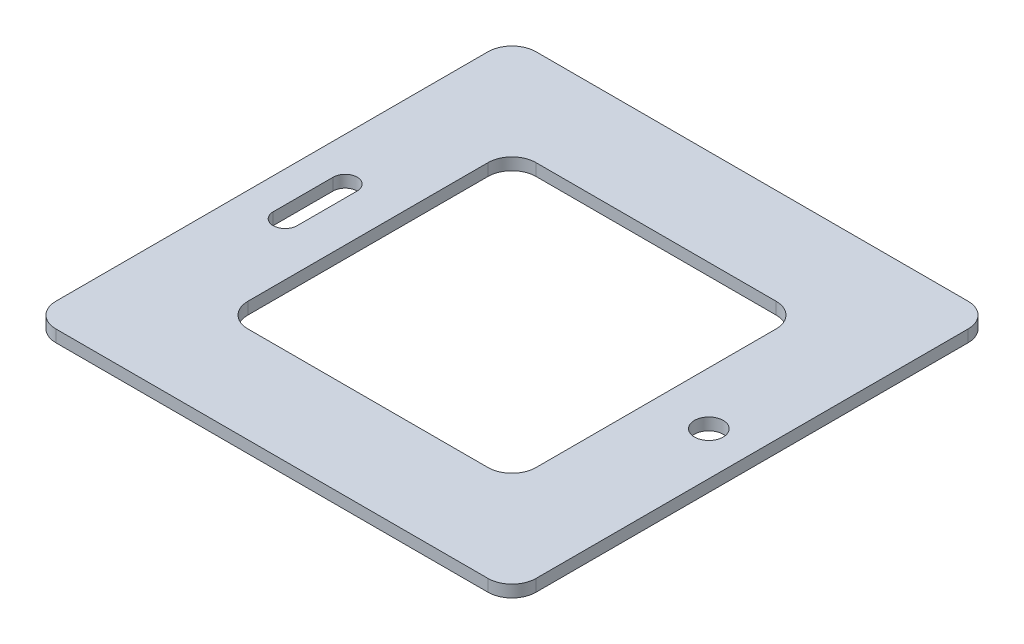
ISO-10303-21;
HEADER;
FILE_DESCRIPTION(('STEP AP214'),'2;1');
FILE_NAME('part.step','',(''),(''),'','','');
FILE_SCHEMA(('AUTOMOTIVE_DESIGN { 1 0 10303 214 1 1 1 1 }'));
ENDSEC;
DATA;
#1=APPLICATION_CONTEXT('core data for automotive mechanical design processes');
#2=APPLICATION_PROTOCOL_DEFINITION('international standard','automotive_design',2000,#1);
#3=PRODUCT_CONTEXT('',#1,'mechanical');
#4=PRODUCT('Part','Part','',(#3));
#5=PRODUCT_RELATED_PRODUCT_CATEGORY('part','',(#4));
#6=PRODUCT_DEFINITION_FORMATION('','',#4);
#7=PRODUCT_DEFINITION_CONTEXT('part definition',#1,'design');
#8=PRODUCT_DEFINITION('design','',#6,#7);
#9=PRODUCT_DEFINITION_SHAPE('','',#8);
#10=(LENGTH_UNIT() NAMED_UNIT(*) SI_UNIT(.MILLI.,.METRE.));
#11=(NAMED_UNIT(*) PLANE_ANGLE_UNIT() SI_UNIT($,.RADIAN.));
#12=(NAMED_UNIT(*) SI_UNIT($,.STERADIAN.) SOLID_ANGLE_UNIT());
#13=UNCERTAINTY_MEASURE_WITH_UNIT(LENGTH_MEASURE(1.E-05),#10,'distance_accuracy_value','');
#14=(GEOMETRIC_REPRESENTATION_CONTEXT(3) GLOBAL_UNCERTAINTY_ASSIGNED_CONTEXT((#13)) GLOBAL_UNIT_ASSIGNED_CONTEXT((#10,
#11,#12)) REPRESENTATION_CONTEXT('',''));
#15=CARTESIAN_POINT('',(0.,0.,0.));
#16=DIRECTION('',(0.,0.,1.));
#17=DIRECTION('',(1.,0.,0.));
#18=AXIS2_PLACEMENT_3D('',#15,#16,#17);
#19=CARTESIAN_POINT('',(0.,5.,0.));
#20=DIRECTION('',(0.,-1.,0.));
#21=DIRECTION('',(0.,0.,-1.));
#22=AXIS2_PLACEMENT_3D('',#19,#20,#21);
#23=PLANE('',#22);
#24=CARTESIAN_POINT('',(82.,5.,0.));
#25=DIRECTION('',(0.,1.,0.));
#26=DIRECTION('',(0.,0.,1.));
#27=AXIS2_PLACEMENT_3D('',#24,#25,#26);
#28=CIRCLE('',#27,6.);
#29=CARTESIAN_POINT('',(82.,5.,6.));
#30=VERTEX_POINT('',#29);
#31=EDGE_CURVE('E200',#30,#30,#28,.T.);
#32=ORIENTED_EDGE('',*,*,#31,.F.);
#33=EDGE_LOOP('',(#32));
#34=FACE_BOUND('',#33,.T.);
#35=DIRECTION('',(0.,0.,-1.));
#36=VECTOR('',#35,1.);
#37=CARTESIAN_POINT('',(-77.,5.,12.5));
#38=LINE('',#37,#36);
#39=CARTESIAN_POINT('',(-77.,5.,12.5));
#40=VERTEX_POINT('',#39);
#41=CARTESIAN_POINT('',(-77.,5.,-12.5));
#42=VERTEX_POINT('',#41);
#43=EDGE_CURVE('E199',#40,#42,#38,.T.);
#44=ORIENTED_EDGE('',*,*,#43,.F.);
#45=CARTESIAN_POINT('',(-82.,5.,12.5));
#46=DIRECTION('',(0.,1.,0.));
#47=DIRECTION('',(0.,0.,1.));
#48=AXIS2_PLACEMENT_3D('',#45,#46,#47);
#49=CIRCLE('',#48,5.);
#50=CARTESIAN_POINT('',(-87.,5.,12.5));
#51=VERTEX_POINT('',#50);
#52=EDGE_CURVE('E179',#51,#40,#49,.T.);
#53=ORIENTED_EDGE('',*,*,#52,.F.);
#54=DIRECTION('',(0.,0.,1.));
#55=VECTOR('',#54,1.);
#56=CARTESIAN_POINT('',(-87.,5.,12.5));
#57=LINE('',#56,#55);
#58=CARTESIAN_POINT('',(-87.,5.,-12.5));
#59=VERTEX_POINT('',#58);
#60=EDGE_CURVE('E188',#59,#51,#57,.T.);
#61=ORIENTED_EDGE('',*,*,#60,.F.);
#62=CARTESIAN_POINT('',(-82.,5.,-12.5));
#63=DIRECTION('',(0.,1.,0.));
#64=DIRECTION('',(0.,0.,1.));
#65=AXIS2_PLACEMENT_3D('',#62,#63,#64);
#66=CIRCLE('',#65,5.);
#67=EDGE_CURVE('E194',#42,#59,#66,.T.);
#68=ORIENTED_EDGE('',*,*,#67,.F.);
#69=EDGE_LOOP('',(#44,#53,#61,#68));
#70=FACE_BOUND('',#69,.T.);
#71=DIRECTION('',(-1.,0.,0.));
#72=VECTOR('',#71,1.);
#73=CARTESIAN_POINT('',(-100.,5.,-100.));
#74=LINE('',#73,#72);
#75=CARTESIAN_POINT('',(90.,5.,-100.));
#76=VERTEX_POINT('',#75);
#77=CARTESIAN_POINT('',(-90.,5.,-100.));
#78=VERTEX_POINT('',#77);
#79=EDGE_CURVE('E271',#76,#78,#74,.T.);
#80=ORIENTED_EDGE('',*,*,#79,.T.);
#81=CARTESIAN_POINT('',(-90.,5.,-90.));
#82=DIRECTION('',(0.,-1.,0.));
#83=DIRECTION('',(0.,0.,-1.));
#84=AXIS2_PLACEMENT_3D('',#81,#82,#83);
#85=CIRCLE('',#84,10.);
#86=CARTESIAN_POINT('',(-100.,5.,-90.));
#87=VERTEX_POINT('',#86);
#88=EDGE_CURVE('E321',#78,#87,#85,.F.);
#89=ORIENTED_EDGE('',*,*,#88,.T.);
#90=DIRECTION('',(0.,0.,1.));
#91=VECTOR('',#90,1.);
#92=CARTESIAN_POINT('',(-100.,5.,100.));
#93=LINE('',#92,#91);
#94=CARTESIAN_POINT('',(-100.,5.,90.));
#95=VERTEX_POINT('',#94);
#96=EDGE_CURVE('E275',#87,#95,#93,.T.);
#97=ORIENTED_EDGE('',*,*,#96,.T.);
#98=CARTESIAN_POINT('',(-90.,5.,90.));
#99=DIRECTION('',(0.,-1.,0.));
#100=DIRECTION('',(0.,0.,-1.));
#101=AXIS2_PLACEMENT_3D('',#98,#99,#100);
#102=CIRCLE('',#101,10.);
#103=CARTESIAN_POINT('',(-90.,5.,100.));
#104=VERTEX_POINT('',#103);
#105=EDGE_CURVE('E59',#95,#104,#102,.F.);
#106=ORIENTED_EDGE('',*,*,#105,.T.);
#107=DIRECTION('',(1.,0.,0.));
#108=VECTOR('',#107,1.);
#109=CARTESIAN_POINT('',(-100.,5.,100.));
#110=LINE('',#109,#108);
#111=CARTESIAN_POINT('',(90.,5.,100.));
#112=VERTEX_POINT('',#111);
#113=EDGE_CURVE('E277',#104,#112,#110,.T.);
#114=ORIENTED_EDGE('',*,*,#113,.T.);
#115=CARTESIAN_POINT('',(90.,5.,90.));
#116=DIRECTION('',(0.,-1.,0.));
#117=DIRECTION('',(0.,0.,-1.));
#118=AXIS2_PLACEMENT_3D('',#115,#116,#117);
#119=CIRCLE('',#118,10.);
#120=CARTESIAN_POINT('',(100.,5.,90.));
#121=VERTEX_POINT('',#120);
#122=EDGE_CURVE('E316',#112,#121,#119,.F.);
#123=ORIENTED_EDGE('',*,*,#122,.T.);
#124=DIRECTION('',(0.,0.,-1.));
#125=VECTOR('',#124,1.);
#126=CARTESIAN_POINT('',(100.,5.,100.));
#127=LINE('',#126,#125);
#128=CARTESIAN_POINT('',(100.,5.,-90.));
#129=VERTEX_POINT('',#128);
#130=EDGE_CURVE('E268',#121,#129,#127,.T.);
#131=ORIENTED_EDGE('',*,*,#130,.T.);
#132=CARTESIAN_POINT('',(90.,5.,-90.));
#133=DIRECTION('',(0.,-1.,0.));
#134=DIRECTION('',(0.,0.,-1.));
#135=AXIS2_PLACEMENT_3D('',#132,#133,#134);
#136=CIRCLE('',#135,10.);
#137=EDGE_CURVE('E318',#129,#76,#136,.F.);
#138=ORIENTED_EDGE('',*,*,#137,.T.);
#139=EDGE_LOOP('',(#80,#89,#97,#106,#114,#123,#131,#138));
#140=FACE_BOUND('',#139,.T.);
#141=CARTESIAN_POINT('',(-50.,5.,50.));
#142=DIRECTION('',(0.,1.,0.));
#143=DIRECTION('',(0.,0.,-1.));
#144=AXIS2_PLACEMENT_3D('',#141,#142,#143);
#145=CIRCLE('',#144,9.99999999999999);
#146=CARTESIAN_POINT('',(-60.,5.,49.9999999999999));
#147=VERTEX_POINT('',#146);
#148=CARTESIAN_POINT('',(-49.9999999999999,5.,60.));
#149=VERTEX_POINT('',#148);
#150=EDGE_CURVE('E208',#147,#149,#145,.T.);
#151=ORIENTED_EDGE('',*,*,#150,.F.);
#152=DIRECTION('',(0.,0.,1.));
#153=VECTOR('',#152,1.);
#154=CARTESIAN_POINT('',(-60.,5.,49.9999999999999));
#155=LINE('',#154,#153);
#156=CARTESIAN_POINT('',(-60.,5.,-49.9999999999999));
#157=VERTEX_POINT('',#156);
#158=EDGE_CURVE('E224',#157,#147,#155,.T.);
#159=ORIENTED_EDGE('',*,*,#158,.F.);
#160=CARTESIAN_POINT('',(-50.,5.,-50.));
#161=DIRECTION('',(0.,1.,0.));
#162=DIRECTION('',(0.,0.,-1.));
#163=AXIS2_PLACEMENT_3D('',#160,#161,#162);
#164=CIRCLE('',#163,9.99999999999999);
#165=CARTESIAN_POINT('',(-49.9999999999999,5.,-60.));
#166=VERTEX_POINT('',#165);
#167=EDGE_CURVE('E221',#166,#157,#164,.T.);
#168=ORIENTED_EDGE('',*,*,#167,.F.);
#169=DIRECTION('',(-1.,0.,0.));
#170=VECTOR('',#169,1.);
#171=CARTESIAN_POINT('',(-49.9999999999999,5.,-60.));
#172=LINE('',#171,#170);
#173=CARTESIAN_POINT('',(49.9999999999999,5.,-60.));
#174=VERTEX_POINT('',#173);
#175=EDGE_CURVE('E219',#174,#166,#172,.T.);
#176=ORIENTED_EDGE('',*,*,#175,.F.);
#177=CARTESIAN_POINT('',(50.,5.,-50.));
#178=DIRECTION('',(0.,1.,0.));
#179=DIRECTION('',(0.,0.,-1.));
#180=AXIS2_PLACEMENT_3D('',#177,#178,#179);
#181=CIRCLE('',#180,9.99999999999999);
#182=CARTESIAN_POINT('',(60.,5.,-49.9999999999999));
#183=VERTEX_POINT('',#182);
#184=EDGE_CURVE('E217',#183,#174,#181,.T.);
#185=ORIENTED_EDGE('',*,*,#184,.F.);
#186=DIRECTION('',(0.,0.,-1.));
#187=VECTOR('',#186,1.);
#188=CARTESIAN_POINT('',(60.,5.,49.9999999999999));
#189=LINE('',#188,#187);
#190=CARTESIAN_POINT('',(60.,5.,49.9999999999999));
#191=VERTEX_POINT('',#190);
#192=EDGE_CURVE('E215',#191,#183,#189,.T.);
#193=ORIENTED_EDGE('',*,*,#192,.F.);
#194=CARTESIAN_POINT('',(50.,5.,50.));
#195=DIRECTION('',(0.,1.,0.));
#196=DIRECTION('',(0.,0.,1.));
#197=AXIS2_PLACEMENT_3D('',#194,#195,#196);
#198=CIRCLE('',#197,9.99999999999999);
#199=CARTESIAN_POINT('',(49.9999999999999,5.,60.));
#200=VERTEX_POINT('',#199);
#201=EDGE_CURVE('E213',#200,#191,#198,.T.);
#202=ORIENTED_EDGE('',*,*,#201,.F.);
#203=DIRECTION('',(1.,0.,0.));
#204=VECTOR('',#203,1.);
#205=CARTESIAN_POINT('',(-49.9999999999999,5.,60.));
#206=LINE('',#205,#204);
#207=EDGE_CURVE('E210',#149,#200,#206,.T.);
#208=ORIENTED_EDGE('',*,*,#207,.F.);
#209=EDGE_LOOP('',(#151,#159,#168,#176,#185,#193,#202,#208));
#210=FACE_BOUND('',#209,.T.);
#211=ADVANCED_FACE('F37',(#34,#70,#140,#210),#23,.F.);
#212=CARTESIAN_POINT('',(0.,0.,0.));
#213=DIRECTION('',(0.,-1.,0.));
#214=DIRECTION('',(0.,0.,-1.));
#215=AXIS2_PLACEMENT_3D('',#212,#213,#214);
#216=PLANE('',#215);
#217=CARTESIAN_POINT('',(82.,0.,0.));
#218=DIRECTION('',(0.,-1.,0.));
#219=DIRECTION('',(0.,0.,-1.));
#220=AXIS2_PLACEMENT_3D('',#217,#218,#219);
#221=CIRCLE('',#220,6.);
#222=CARTESIAN_POINT('',(82.,0.,-6.));
#223=VERTEX_POINT('',#222);
#224=EDGE_CURVE('E203',#223,#223,#221,.T.);
#225=ORIENTED_EDGE('',*,*,#224,.F.);
#226=EDGE_LOOP('',(#225));
#227=FACE_BOUND('',#226,.T.);
#228=CARTESIAN_POINT('',(-82.,0.,12.5));
#229=DIRECTION('',(0.,-1.,0.));
#230=DIRECTION('',(0.,0.,-1.));
#231=AXIS2_PLACEMENT_3D('',#228,#229,#230);
#232=CIRCLE('',#231,5.);
#233=CARTESIAN_POINT('',(-77.,0.,12.5));
#234=VERTEX_POINT('',#233);
#235=CARTESIAN_POINT('',(-87.,0.,12.5));
#236=VERTEX_POINT('',#235);
#237=EDGE_CURVE('E182',#234,#236,#232,.T.);
#238=ORIENTED_EDGE('',*,*,#237,.F.);
#239=DIRECTION('',(0.,0.,1.));
#240=VECTOR('',#239,1.);
#241=CARTESIAN_POINT('',(-77.,0.,0.));
#242=LINE('',#241,#240);
#243=CARTESIAN_POINT('',(-77.,0.,-12.5));
#244=VERTEX_POINT('',#243);
#245=EDGE_CURVE('E279',#244,#234,#242,.T.);
#246=ORIENTED_EDGE('',*,*,#245,.F.);
#247=CARTESIAN_POINT('',(-82.,0.,-12.5));
#248=DIRECTION('',(0.,-1.,0.));
#249=DIRECTION('',(0.,0.,-1.));
#250=AXIS2_PLACEMENT_3D('',#247,#248,#249);
#251=CIRCLE('',#250,5.);
#252=CARTESIAN_POINT('',(-87.,0.,-12.5));
#253=VERTEX_POINT('',#252);
#254=EDGE_CURVE('E290',#253,#244,#251,.T.);
#255=ORIENTED_EDGE('',*,*,#254,.F.);
#256=DIRECTION('',(0.,0.,-1.));
#257=VECTOR('',#256,1.);
#258=CARTESIAN_POINT('',(-87.,0.,0.));
#259=LINE('',#258,#257);
#260=EDGE_CURVE('E293',#236,#253,#259,.T.);
#261=ORIENTED_EDGE('',*,*,#260,.F.);
#262=EDGE_LOOP('',(#238,#246,#255,#261));
#263=FACE_BOUND('',#262,.T.);
#264=DIRECTION('',(0.,0.,1.));
#265=VECTOR('',#264,1.);
#266=CARTESIAN_POINT('',(-100.,0.,100.));
#267=LINE('',#266,#265);
#268=CARTESIAN_POINT('',(-100.,0.,-90.));
#269=VERTEX_POINT('',#268);
#270=CARTESIAN_POINT('',(-100.,0.,90.));
#271=VERTEX_POINT('',#270);
#272=EDGE_CURVE('E285',#269,#271,#267,.T.);
#273=ORIENTED_EDGE('',*,*,#272,.F.);
#274=CARTESIAN_POINT('',(-90.,0.,-90.));
#275=DIRECTION('',(0.,-1.,0.));
#276=DIRECTION('',(0.,0.,-1.));
#277=AXIS2_PLACEMENT_3D('',#274,#275,#276);
#278=CIRCLE('',#277,10.);
#279=CARTESIAN_POINT('',(-90.,0.,-100.));
#280=VERTEX_POINT('',#279);
#281=EDGE_CURVE('E309',#269,#280,#278,.T.);
#282=ORIENTED_EDGE('',*,*,#281,.T.);
#283=DIRECTION('',(-1.,0.,0.));
#284=VECTOR('',#283,1.);
#285=CARTESIAN_POINT('',(-100.,0.,-100.));
#286=LINE('',#285,#284);
#287=CARTESIAN_POINT('',(90.,0.,-100.));
#288=VERTEX_POINT('',#287);
#289=EDGE_CURVE('E282',#288,#280,#286,.T.);
#290=ORIENTED_EDGE('',*,*,#289,.F.);
#291=CARTESIAN_POINT('',(90.,0.,-90.));
#292=DIRECTION('',(0.,-1.,0.));
#293=DIRECTION('',(0.,0.,-1.));
#294=AXIS2_PLACEMENT_3D('',#291,#292,#293);
#295=CIRCLE('',#294,10.);
#296=CARTESIAN_POINT('',(100.,0.,-90.));
#297=VERTEX_POINT('',#296);
#298=EDGE_CURVE('E305',#288,#297,#295,.T.);
#299=ORIENTED_EDGE('',*,*,#298,.T.);
#300=DIRECTION('',(0.,0.,-1.));
#301=VECTOR('',#300,1.);
#302=CARTESIAN_POINT('',(100.,0.,100.));
#303=LINE('',#302,#301);
#304=CARTESIAN_POINT('',(100.,0.,90.));
#305=VERTEX_POINT('',#304);
#306=EDGE_CURVE('E267',#305,#297,#303,.T.);
#307=ORIENTED_EDGE('',*,*,#306,.F.);
#308=CARTESIAN_POINT('',(90.,0.,90.));
#309=DIRECTION('',(0.,-1.,0.));
#310=DIRECTION('',(0.,0.,-1.));
#311=AXIS2_PLACEMENT_3D('',#308,#309,#310);
#312=CIRCLE('',#311,10.);
#313=CARTESIAN_POINT('',(90.,0.,100.));
#314=VERTEX_POINT('',#313);
#315=EDGE_CURVE('E303',#305,#314,#312,.T.);
#316=ORIENTED_EDGE('',*,*,#315,.T.);
#317=DIRECTION('',(1.,0.,0.));
#318=VECTOR('',#317,1.);
#319=CARTESIAN_POINT('',(-100.,0.,100.));
#320=LINE('',#319,#318);
#321=CARTESIAN_POINT('',(-90.,0.,100.));
#322=VERTEX_POINT('',#321);
#323=EDGE_CURVE('E272',#322,#314,#320,.T.);
#324=ORIENTED_EDGE('',*,*,#323,.F.);
#325=CARTESIAN_POINT('',(-90.,0.,90.));
#326=DIRECTION('',(0.,-1.,0.));
#327=DIRECTION('',(0.,0.,-1.));
#328=AXIS2_PLACEMENT_3D('',#325,#326,#327);
#329=CIRCLE('',#328,10.);
#330=EDGE_CURVE('E307',#322,#271,#329,.T.);
#331=ORIENTED_EDGE('',*,*,#330,.T.);
#332=EDGE_LOOP('',(#273,#282,#290,#299,#307,#316,#324,#331));
#333=FACE_BOUND('',#332,.T.);
#334=DIRECTION('',(0.,0.,1.));
#335=VECTOR('',#334,1.);
#336=CARTESIAN_POINT('',(-60.,0.,49.9999999999999));
#337=LINE('',#336,#335);
#338=CARTESIAN_POINT('',(-60.,0.,-49.9999999999999));
#339=VERTEX_POINT('',#338);
#340=CARTESIAN_POINT('',(-60.,0.,49.9999999999999));
#341=VERTEX_POINT('',#340);
#342=EDGE_CURVE('E211',#339,#341,#337,.T.);
#343=ORIENTED_EDGE('',*,*,#342,.T.);
#344=CARTESIAN_POINT('',(-50.,0.,50.));
#345=DIRECTION('',(0.,1.,0.));
#346=DIRECTION('',(0.,0.,-1.));
#347=AXIS2_PLACEMENT_3D('',#344,#345,#346);
#348=CIRCLE('',#347,9.99999999999999);
#349=CARTESIAN_POINT('',(-49.9999999999999,0.,60.));
#350=VERTEX_POINT('',#349);
#351=EDGE_CURVE('E227',#341,#350,#348,.T.);
#352=ORIENTED_EDGE('',*,*,#351,.T.);
#353=DIRECTION('',(1.,0.,0.));
#354=VECTOR('',#353,1.);
#355=CARTESIAN_POINT('',(-49.9999999999999,0.,60.));
#356=LINE('',#355,#354);
#357=CARTESIAN_POINT('',(49.9999999999999,0.,60.));
#358=VERTEX_POINT('',#357);
#359=EDGE_CURVE('E230',#350,#358,#356,.T.);
#360=ORIENTED_EDGE('',*,*,#359,.T.);
#361=CARTESIAN_POINT('',(50.,0.,50.));
#362=DIRECTION('',(0.,1.,0.));
#363=DIRECTION('',(0.,0.,1.));
#364=AXIS2_PLACEMENT_3D('',#361,#362,#363);
#365=CIRCLE('',#364,9.99999999999999);
#366=CARTESIAN_POINT('',(60.,0.,49.9999999999999));
#367=VERTEX_POINT('',#366);
#368=EDGE_CURVE('E233',#358,#367,#365,.T.);
#369=ORIENTED_EDGE('',*,*,#368,.T.);
#370=DIRECTION('',(0.,0.,-1.));
#371=VECTOR('',#370,1.);
#372=CARTESIAN_POINT('',(60.,0.,49.9999999999999));
#373=LINE('',#372,#371);
#374=CARTESIAN_POINT('',(60.,0.,-49.9999999999999));
#375=VERTEX_POINT('',#374);
#376=EDGE_CURVE('E236',#367,#375,#373,.T.);
#377=ORIENTED_EDGE('',*,*,#376,.T.);
#378=CARTESIAN_POINT('',(50.,0.,-50.));
#379=DIRECTION('',(0.,1.,0.));
#380=DIRECTION('',(0.,0.,-1.));
#381=AXIS2_PLACEMENT_3D('',#378,#379,#380);
#382=CIRCLE('',#381,9.99999999999999);
#383=CARTESIAN_POINT('',(49.9999999999999,0.,-60.));
#384=VERTEX_POINT('',#383);
#385=EDGE_CURVE('E239',#375,#384,#382,.T.);
#386=ORIENTED_EDGE('',*,*,#385,.T.);
#387=DIRECTION('',(-1.,0.,0.));
#388=VECTOR('',#387,1.);
#389=CARTESIAN_POINT('',(-49.9999999999999,0.,-60.));
#390=LINE('',#389,#388);
#391=CARTESIAN_POINT('',(-49.9999999999999,0.,-60.));
#392=VERTEX_POINT('',#391);
#393=EDGE_CURVE('E242',#384,#392,#390,.T.);
#394=ORIENTED_EDGE('',*,*,#393,.T.);
#395=CARTESIAN_POINT('',(-50.,0.,-50.));
#396=DIRECTION('',(0.,1.,0.));
#397=DIRECTION('',(0.,0.,-1.));
#398=AXIS2_PLACEMENT_3D('',#395,#396,#397);
#399=CIRCLE('',#398,9.99999999999999);
#400=EDGE_CURVE('E245',#392,#339,#399,.T.);
#401=ORIENTED_EDGE('',*,*,#400,.T.);
#402=EDGE_LOOP('',(#343,#352,#360,#369,#377,#386,#394,#401));
#403=FACE_BOUND('',#402,.T.);
#404=ADVANCED_FACE('F337',(#227,#263,#333,#403),#216,.T.);
#405=CARTESIAN_POINT('',(100.,5.,100.));
#406=DIRECTION('',(-1.,0.,0.));
#407=DIRECTION('',(0.,0.,1.));
#408=AXIS2_PLACEMENT_3D('',#405,#406,#407);
#409=PLANE('',#408);
#410=ORIENTED_EDGE('',*,*,#306,.T.);
#411=DIRECTION('',(0.,-1.,0.));
#412=VECTOR('',#411,1.);
#413=CARTESIAN_POINT('',(100.,5.,-90.));
#414=LINE('',#413,#412);
#415=EDGE_CURVE('E11',#297,#129,#414,.F.);
#416=ORIENTED_EDGE('',*,*,#415,.T.);
#417=ORIENTED_EDGE('',*,*,#130,.F.);
#418=DIRECTION('',(0.,-1.,0.));
#419=VECTOR('',#418,1.);
#420=CARTESIAN_POINT('',(100.,5.,90.));
#421=LINE('',#420,#419);
#422=EDGE_CURVE('E45',#121,#305,#421,.T.);
#423=ORIENTED_EDGE('',*,*,#422,.T.);
#424=EDGE_LOOP('',(#410,#416,#417,#423));
#425=FACE_BOUND('',#424,.T.);
#426=ADVANCED_FACE('F331',(#425),#409,.F.);
#427=CARTESIAN_POINT('',(-100.,5.,-100.));
#428=DIRECTION('',(0.,0.,1.));
#429=DIRECTION('',(1.,0.,0.));
#430=AXIS2_PLACEMENT_3D('',#427,#428,#429);
#431=PLANE('',#430);
#432=ORIENTED_EDGE('',*,*,#289,.T.);
#433=DIRECTION('',(0.,-1.,0.));
#434=VECTOR('',#433,1.);
#435=CARTESIAN_POINT('',(-90.,5.,-100.));
#436=LINE('',#435,#434);
#437=EDGE_CURVE('E314',#280,#78,#436,.F.);
#438=ORIENTED_EDGE('',*,*,#437,.T.);
#439=ORIENTED_EDGE('',*,*,#79,.F.);
#440=DIRECTION('',(0.,-1.,0.));
#441=VECTOR('',#440,1.);
#442=CARTESIAN_POINT('',(90.,5.,-100.));
#443=LINE('',#442,#441);
#444=EDGE_CURVE('E311',#76,#288,#443,.T.);
#445=ORIENTED_EDGE('',*,*,#444,.T.);
#446=EDGE_LOOP('',(#432,#438,#439,#445));
#447=FACE_BOUND('',#446,.T.);
#448=ADVANCED_FACE('F347',(#447),#431,.F.);
#449=CARTESIAN_POINT('',(-100.,5.,100.));
#450=DIRECTION('',(1.,0.,0.));
#451=DIRECTION('',(0.,0.,-1.));
#452=AXIS2_PLACEMENT_3D('',#449,#450,#451);
#453=PLANE('',#452);
#454=ORIENTED_EDGE('',*,*,#96,.F.);
#455=DIRECTION('',(0.,-1.,0.));
#456=VECTOR('',#455,1.);
#457=CARTESIAN_POINT('',(-100.,5.,-90.));
#458=LINE('',#457,#456);
#459=EDGE_CURVE('E300',#87,#269,#458,.T.);
#460=ORIENTED_EDGE('',*,*,#459,.T.);
#461=ORIENTED_EDGE('',*,*,#272,.T.);
#462=DIRECTION('',(0.,-1.,0.));
#463=VECTOR('',#462,1.);
#464=CARTESIAN_POINT('',(-100.,5.,90.));
#465=LINE('',#464,#463);
#466=EDGE_CURVE('E296',#271,#95,#465,.F.);
#467=ORIENTED_EDGE('',*,*,#466,.T.);
#468=EDGE_LOOP('',(#454,#460,#461,#467));
#469=FACE_BOUND('',#468,.T.);
#470=ADVANCED_FACE('F356',(#469),#453,.F.);
#471=CARTESIAN_POINT('',(-100.,5.,100.));
#472=DIRECTION('',(0.,0.,-1.));
#473=DIRECTION('',(-1.,0.,0.));
#474=AXIS2_PLACEMENT_3D('',#471,#472,#473);
#475=PLANE('',#474);
#476=ORIENTED_EDGE('',*,*,#113,.F.);
#477=DIRECTION('',(0.,-1.,0.));
#478=VECTOR('',#477,1.);
#479=CARTESIAN_POINT('',(-90.,5.,100.));
#480=LINE('',#479,#478);
#481=EDGE_CURVE('E324',#104,#322,#480,.T.);
#482=ORIENTED_EDGE('',*,*,#481,.T.);
#483=ORIENTED_EDGE('',*,*,#323,.T.);
#484=DIRECTION('',(0.,-1.,0.));
#485=VECTOR('',#484,1.);
#486=CARTESIAN_POINT('',(90.,5.,100.));
#487=LINE('',#486,#485);
#488=EDGE_CURVE('E52',#314,#112,#487,.F.);
#489=ORIENTED_EDGE('',*,*,#488,.T.);
#490=EDGE_LOOP('',(#476,#482,#483,#489));
#491=FACE_BOUND('',#490,.T.);
#492=ADVANCED_FACE('F361',(#491),#475,.F.);
#493=CARTESIAN_POINT('',(-50.,5.,50.));
#494=DIRECTION('',(0.,-1.,0.));
#495=DIRECTION('',(0.,0.,-1.));
#496=AXIS2_PLACEMENT_3D('',#493,#494,#495);
#497=CYLINDRICAL_SURFACE('',#496,9.99999999999999);
#498=ORIENTED_EDGE('',*,*,#351,.F.);
#499=DIRECTION('',(0.,-1.,0.));
#500=VECTOR('',#499,1.);
#501=CARTESIAN_POINT('',(-60.,5.,49.9999999999999));
#502=LINE('',#501,#500);
#503=EDGE_CURVE('E226',#147,#341,#502,.T.);
#504=ORIENTED_EDGE('',*,*,#503,.F.);
#505=ORIENTED_EDGE('',*,*,#150,.T.);
#506=DIRECTION('',(0.,-1.,0.));
#507=VECTOR('',#506,1.);
#508=CARTESIAN_POINT('',(-49.9999999999999,5.,60.));
#509=LINE('',#508,#507);
#510=EDGE_CURVE('E264',#149,#350,#509,.T.);
#511=ORIENTED_EDGE('',*,*,#510,.T.);
#512=EDGE_LOOP('',(#498,#504,#505,#511));
#513=FACE_BOUND('',#512,.T.);
#514=ADVANCED_FACE('F376',(#513),#497,.F.);
#515=CARTESIAN_POINT('',(-49.9999999999999,5.,60.));
#516=DIRECTION('',(0.,0.,-1.));
#517=DIRECTION('',(-1.,0.,0.));
#518=AXIS2_PLACEMENT_3D('',#515,#516,#517);
#519=PLANE('',#518);
#520=ORIENTED_EDGE('',*,*,#359,.F.);
#521=ORIENTED_EDGE('',*,*,#510,.F.);
#522=ORIENTED_EDGE('',*,*,#207,.T.);
#523=DIRECTION('',(0.,-1.,0.));
#524=VECTOR('',#523,1.);
#525=CARTESIAN_POINT('',(49.9999999999999,5.,60.));
#526=LINE('',#525,#524);
#527=EDGE_CURVE('E262',#200,#358,#526,.T.);
#528=ORIENTED_EDGE('',*,*,#527,.T.);
#529=EDGE_LOOP('',(#520,#521,#522,#528));
#530=FACE_BOUND('',#529,.T.);
#531=ADVANCED_FACE('F521',(#530),#519,.T.);
#532=CARTESIAN_POINT('',(50.,5.,50.));
#533=DIRECTION('',(0.,-1.,0.));
#534=DIRECTION('',(0.,0.,-1.));
#535=AXIS2_PLACEMENT_3D('',#532,#533,#534);
#536=CYLINDRICAL_SURFACE('',#535,9.99999999999999);
#537=ORIENTED_EDGE('',*,*,#368,.F.);
#538=ORIENTED_EDGE('',*,*,#527,.F.);
#539=ORIENTED_EDGE('',*,*,#201,.T.);
#540=DIRECTION('',(0.,-1.,0.));
#541=VECTOR('',#540,1.);
#542=CARTESIAN_POINT('',(60.,5.,49.9999999999999));
#543=LINE('',#542,#541);
#544=EDGE_CURVE('E260',#191,#367,#543,.T.);
#545=ORIENTED_EDGE('',*,*,#544,.T.);
#546=EDGE_LOOP('',(#537,#538,#539,#545));
#547=FACE_BOUND('',#546,.T.);
#548=ADVANCED_FACE('F511',(#547),#536,.F.);
#549=CARTESIAN_POINT('',(60.,5.,49.9999999999999));
#550=DIRECTION('',(-1.,0.,0.));
#551=DIRECTION('',(0.,0.,1.));
#552=AXIS2_PLACEMENT_3D('',#549,#550,#551);
#553=PLANE('',#552);
#554=ORIENTED_EDGE('',*,*,#376,.F.);
#555=ORIENTED_EDGE('',*,*,#544,.F.);
#556=ORIENTED_EDGE('',*,*,#192,.T.);
#557=DIRECTION('',(0.,-1.,0.));
#558=VECTOR('',#557,1.);
#559=CARTESIAN_POINT('',(60.,5.,-49.9999999999999));
#560=LINE('',#559,#558);
#561=EDGE_CURVE('E258',#183,#375,#560,.T.);
#562=ORIENTED_EDGE('',*,*,#561,.T.);
#563=EDGE_LOOP('',(#554,#555,#556,#562));
#564=FACE_BOUND('',#563,.T.);
#565=ADVANCED_FACE('F501',(#564),#553,.T.);
#566=CARTESIAN_POINT('',(50.,5.,-50.));
#567=DIRECTION('',(0.,-1.,0.));
#568=DIRECTION('',(0.,0.,-1.));
#569=AXIS2_PLACEMENT_3D('',#566,#567,#568);
#570=CYLINDRICAL_SURFACE('',#569,9.99999999999999);
#571=ORIENTED_EDGE('',*,*,#385,.F.);
#572=ORIENTED_EDGE('',*,*,#561,.F.);
#573=ORIENTED_EDGE('',*,*,#184,.T.);
#574=DIRECTION('',(0.,-1.,0.));
#575=VECTOR('',#574,1.);
#576=CARTESIAN_POINT('',(49.9999999999999,5.,-60.));
#577=LINE('',#576,#575);
#578=EDGE_CURVE('E256',#174,#384,#577,.T.);
#579=ORIENTED_EDGE('',*,*,#578,.T.);
#580=EDGE_LOOP('',(#571,#572,#573,#579));
#581=FACE_BOUND('',#580,.T.);
#582=ADVANCED_FACE('F491',(#581),#570,.F.);
#583=CARTESIAN_POINT('',(-49.9999999999999,5.,-60.));
#584=DIRECTION('',(0.,0.,1.));
#585=DIRECTION('',(1.,0.,0.));
#586=AXIS2_PLACEMENT_3D('',#583,#584,#585);
#587=PLANE('',#586);
#588=ORIENTED_EDGE('',*,*,#393,.F.);
#589=ORIENTED_EDGE('',*,*,#578,.F.);
#590=ORIENTED_EDGE('',*,*,#175,.T.);
#591=DIRECTION('',(0.,-1.,0.));
#592=VECTOR('',#591,1.);
#593=CARTESIAN_POINT('',(-49.9999999999999,5.,-60.));
#594=LINE('',#593,#592);
#595=EDGE_CURVE('E254',#166,#392,#594,.T.);
#596=ORIENTED_EDGE('',*,*,#595,.T.);
#597=EDGE_LOOP('',(#588,#589,#590,#596));
#598=FACE_BOUND('',#597,.T.);
#599=ADVANCED_FACE('F481',(#598),#587,.T.);
#600=CARTESIAN_POINT('',(-50.,5.,-50.));
#601=DIRECTION('',(0.,-1.,0.));
#602=DIRECTION('',(0.,0.,-1.));
#603=AXIS2_PLACEMENT_3D('',#600,#601,#602);
#604=CYLINDRICAL_SURFACE('',#603,9.99999999999999);
#605=ORIENTED_EDGE('',*,*,#400,.F.);
#606=ORIENTED_EDGE('',*,*,#595,.F.);
#607=ORIENTED_EDGE('',*,*,#167,.T.);
#608=DIRECTION('',(0.,-1.,0.));
#609=VECTOR('',#608,1.);
#610=CARTESIAN_POINT('',(-60.,5.,-49.9999999999999));
#611=LINE('',#610,#609);
#612=EDGE_CURVE('E252',#157,#339,#611,.T.);
#613=ORIENTED_EDGE('',*,*,#612,.T.);
#614=EDGE_LOOP('',(#605,#606,#607,#613));
#615=FACE_BOUND('',#614,.T.);
#616=ADVANCED_FACE('F471',(#615),#604,.F.);
#617=CARTESIAN_POINT('',(-60.,5.,49.9999999999999));
#618=DIRECTION('',(1.,0.,0.));
#619=DIRECTION('',(0.,0.,-1.));
#620=AXIS2_PLACEMENT_3D('',#617,#618,#619);
#621=PLANE('',#620);
#622=ORIENTED_EDGE('',*,*,#342,.F.);
#623=ORIENTED_EDGE('',*,*,#612,.F.);
#624=ORIENTED_EDGE('',*,*,#158,.T.);
#625=ORIENTED_EDGE('',*,*,#503,.T.);
#626=EDGE_LOOP('',(#622,#623,#624,#625));
#627=FACE_BOUND('',#626,.T.);
#628=ADVANCED_FACE('F462',(#627),#621,.T.);
#629=CARTESIAN_POINT('',(-82.,-7.,12.5));
#630=DIRECTION('',(0.,1.,0.));
#631=DIRECTION('',(0.,0.,1.));
#632=AXIS2_PLACEMENT_3D('',#629,#630,#631);
#633=CYLINDRICAL_SURFACE('',#632,5.);
#634=ORIENTED_EDGE('',*,*,#237,.T.);
#635=DIRECTION('',(0.,1.,0.));
#636=VECTOR('',#635,1.);
#637=CARTESIAN_POINT('',(-87.,-7.,12.5));
#638=LINE('',#637,#636);
#639=EDGE_CURVE('E174',#236,#51,#638,.T.);
#640=ORIENTED_EDGE('',*,*,#639,.T.);
#641=ORIENTED_EDGE('',*,*,#52,.T.);
#642=DIRECTION('',(0.,1.,0.));
#643=VECTOR('',#642,1.);
#644=CARTESIAN_POINT('',(-77.,-7.,12.5));
#645=LINE('',#644,#643);
#646=EDGE_CURVE('E195',#234,#40,#645,.T.);
#647=ORIENTED_EDGE('',*,*,#646,.F.);
#648=EDGE_LOOP('',(#634,#640,#641,#647));
#649=FACE_BOUND('',#648,.T.);
#650=ADVANCED_FACE('F176',(#649),#633,.F.);
#651=CARTESIAN_POINT('',(-87.,-7.,12.5));
#652=DIRECTION('',(-1.,0.,0.));
#653=DIRECTION('',(0.,0.,1.));
#654=AXIS2_PLACEMENT_3D('',#651,#652,#653);
#655=PLANE('',#654);
#656=ORIENTED_EDGE('',*,*,#260,.T.);
#657=DIRECTION('',(0.,1.,0.));
#658=VECTOR('',#657,1.);
#659=CARTESIAN_POINT('',(-87.,-7.,-12.5));
#660=LINE('',#659,#658);
#661=EDGE_CURVE('E185',#253,#59,#660,.T.);
#662=ORIENTED_EDGE('',*,*,#661,.T.);
#663=ORIENTED_EDGE('',*,*,#60,.T.);
#664=ORIENTED_EDGE('',*,*,#639,.F.);
#665=EDGE_LOOP('',(#656,#662,#663,#664));
#666=FACE_BOUND('',#665,.T.);
#667=ADVANCED_FACE('F189',(#666),#655,.F.);
#668=CARTESIAN_POINT('',(-82.,-7.,-12.5));
#669=DIRECTION('',(0.,1.,0.));
#670=DIRECTION('',(0.,0.,1.));
#671=AXIS2_PLACEMENT_3D('',#668,#669,#670);
#672=CYLINDRICAL_SURFACE('',#671,5.);
#673=ORIENTED_EDGE('',*,*,#254,.T.);
#674=DIRECTION('',(0.,1.,0.));
#675=VECTOR('',#674,1.);
#676=CARTESIAN_POINT('',(-77.,-7.,-12.5));
#677=LINE('',#676,#675);
#678=EDGE_CURVE('E638',#244,#42,#677,.T.);
#679=ORIENTED_EDGE('',*,*,#678,.T.);
#680=ORIENTED_EDGE('',*,*,#67,.T.);
#681=ORIENTED_EDGE('',*,*,#661,.F.);
#682=EDGE_LOOP('',(#673,#679,#680,#681));
#683=FACE_BOUND('',#682,.T.);
#684=ADVANCED_FACE('F435',(#683),#672,.F.);
#685=CARTESIAN_POINT('',(-77.,-7.,12.5));
#686=DIRECTION('',(1.,0.,0.));
#687=DIRECTION('',(0.,0.,-1.));
#688=AXIS2_PLACEMENT_3D('',#685,#686,#687);
#689=PLANE('',#688);
#690=ORIENTED_EDGE('',*,*,#245,.T.);
#691=ORIENTED_EDGE('',*,*,#646,.T.);
#692=ORIENTED_EDGE('',*,*,#43,.T.);
#693=ORIENTED_EDGE('',*,*,#678,.F.);
#694=EDGE_LOOP('',(#690,#691,#692,#693));
#695=FACE_BOUND('',#694,.T.);
#696=ADVANCED_FACE('F425',(#695),#689,.F.);
#697=CARTESIAN_POINT('',(82.,-7.,0.));
#698=DIRECTION('',(0.,1.,0.));
#699=DIRECTION('',(0.,0.,1.));
#700=AXIS2_PLACEMENT_3D('',#697,#698,#699);
#701=CYLINDRICAL_SURFACE('',#700,6.);
#702=ORIENTED_EDGE('',*,*,#224,.T.);
#703=EDGE_LOOP('',(#702));
#704=FACE_BOUND('',#703,.T.);
#705=ORIENTED_EDGE('',*,*,#31,.T.);
#706=EDGE_LOOP('',(#705));
#707=FACE_BOUND('',#706,.T.);
#708=ADVANCED_FACE('F389',(#704,#707),#701,.F.);
#709=CARTESIAN_POINT('',(-90.,5.,-90.));
#710=DIRECTION('',(0.,-1.,0.));
#711=DIRECTION('',(0.,0.,-1.));
#712=AXIS2_PLACEMENT_3D('',#709,#710,#711);
#713=CYLINDRICAL_SURFACE('',#712,10.);
#714=ORIENTED_EDGE('',*,*,#88,.F.);
#715=ORIENTED_EDGE('',*,*,#437,.F.);
#716=ORIENTED_EDGE('',*,*,#281,.F.);
#717=ORIENTED_EDGE('',*,*,#459,.F.);
#718=EDGE_LOOP('',(#714,#715,#716,#717));
#719=FACE_BOUND('',#718,.T.);
#720=ADVANCED_FACE('F354',(#719),#713,.T.);
#721=CARTESIAN_POINT('',(-90.,5.,90.));
#722=DIRECTION('',(0.,-1.,0.));
#723=DIRECTION('',(0.,0.,-1.));
#724=AXIS2_PLACEMENT_3D('',#721,#722,#723);
#725=CYLINDRICAL_SURFACE('',#724,10.);
#726=ORIENTED_EDGE('',*,*,#105,.F.);
#727=ORIENTED_EDGE('',*,*,#466,.F.);
#728=ORIENTED_EDGE('',*,*,#330,.F.);
#729=ORIENTED_EDGE('',*,*,#481,.F.);
#730=EDGE_LOOP('',(#726,#727,#728,#729));
#731=FACE_BOUND('',#730,.T.);
#732=ADVANCED_FACE('F360',(#731),#725,.T.);
#733=CARTESIAN_POINT('',(90.,5.,-90.));
#734=DIRECTION('',(0.,-1.,0.));
#735=DIRECTION('',(0.,0.,-1.));
#736=AXIS2_PLACEMENT_3D('',#733,#734,#735);
#737=CYLINDRICAL_SURFACE('',#736,10.);
#738=ORIENTED_EDGE('',*,*,#137,.F.);
#739=ORIENTED_EDGE('',*,*,#415,.F.);
#740=ORIENTED_EDGE('',*,*,#298,.F.);
#741=ORIENTED_EDGE('',*,*,#444,.F.);
#742=EDGE_LOOP('',(#738,#739,#740,#741));
#743=FACE_BOUND('',#742,.T.);
#744=ADVANCED_FACE('F344',(#743),#737,.T.);
#745=CARTESIAN_POINT('',(90.,5.,90.));
#746=DIRECTION('',(0.,-1.,0.));
#747=DIRECTION('',(0.,0.,-1.));
#748=AXIS2_PLACEMENT_3D('',#745,#746,#747);
#749=CYLINDRICAL_SURFACE('',#748,10.);
#750=ORIENTED_EDGE('',*,*,#122,.F.);
#751=ORIENTED_EDGE('',*,*,#488,.F.);
#752=ORIENTED_EDGE('',*,*,#315,.F.);
#753=ORIENTED_EDGE('',*,*,#422,.F.);
#754=EDGE_LOOP('',(#750,#751,#752,#753));
#755=FACE_BOUND('',#754,.T.);
#756=ADVANCED_FACE('F39',(#755),#749,.T.);
#757=CLOSED_SHELL('',(#211,#404,#426,#448,#470,#492,#514,#531,#548,#565,#582,#599,#616,#628,
#650,#667,#684,#696,#708,#720,#732,#744,#756));
#758=MANIFOLD_SOLID_BREP('B2',#757);
#759=ADVANCED_BREP_SHAPE_REPRESENTATION('',(#18,#758),#14);
#760=SHAPE_DEFINITION_REPRESENTATION(#9,#759);
ENDSEC;
END-ISO-10303-21;
